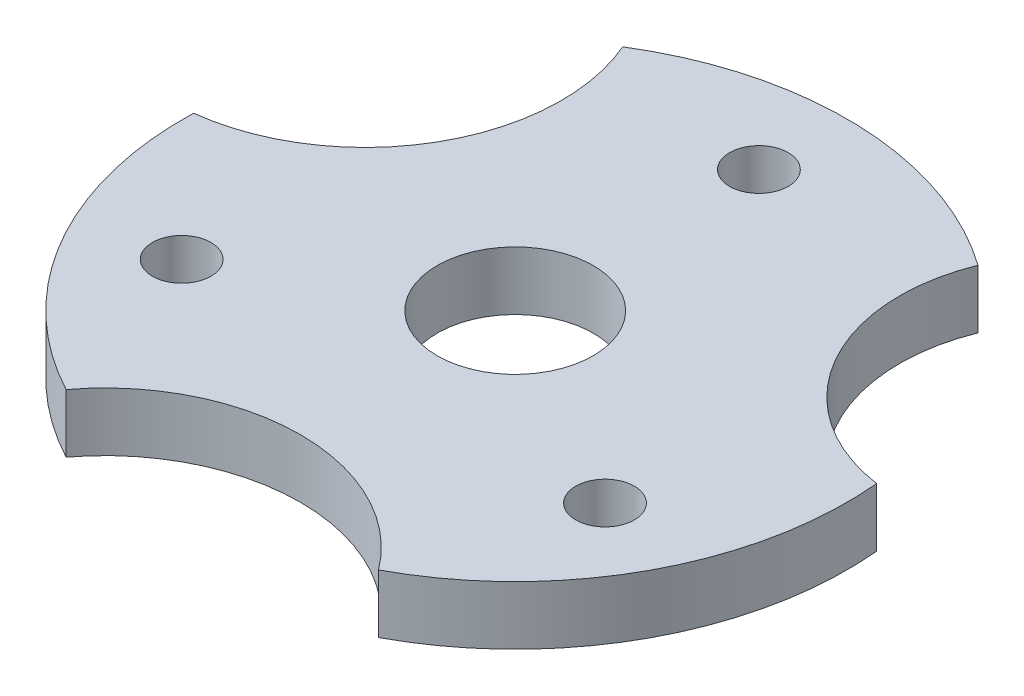
ISO-10303-21;
HEADER;
FILE_DESCRIPTION(('STEP AP214'),'2;1');
FILE_NAME('part.step','',(''),(''),'','','');
FILE_SCHEMA(('AUTOMOTIVE_DESIGN { 1 0 10303 214 1 1 1 1 }'));
ENDSEC;
DATA;
#1=APPLICATION_CONTEXT('core data for automotive mechanical design processes');
#2=APPLICATION_PROTOCOL_DEFINITION('international standard','automotive_design',2000,#1);
#3=PRODUCT_CONTEXT('',#1,'mechanical');
#4=PRODUCT('Part','Part','',(#3));
#5=PRODUCT_RELATED_PRODUCT_CATEGORY('part','',(#4));
#6=PRODUCT_DEFINITION_FORMATION('','',#4);
#7=PRODUCT_DEFINITION_CONTEXT('part definition',#1,'design');
#8=PRODUCT_DEFINITION('design','',#6,#7);
#9=PRODUCT_DEFINITION_SHAPE('','',#8);
#10=(LENGTH_UNIT() NAMED_UNIT(*) SI_UNIT(.MILLI.,.METRE.));
#11=(NAMED_UNIT(*) PLANE_ANGLE_UNIT() SI_UNIT($,.RADIAN.));
#12=(NAMED_UNIT(*) SI_UNIT($,.STERADIAN.) SOLID_ANGLE_UNIT());
#13=UNCERTAINTY_MEASURE_WITH_UNIT(LENGTH_MEASURE(1.E-05),#10,'distance_accuracy_value','');
#14=(GEOMETRIC_REPRESENTATION_CONTEXT(3) GLOBAL_UNCERTAINTY_ASSIGNED_CONTEXT((#13)) GLOBAL_UNIT_ASSIGNED_CONTEXT((#10,
#11,#12)) REPRESENTATION_CONTEXT('',''));
#15=CARTESIAN_POINT('',(0.,0.,0.));
#16=DIRECTION('',(0.,0.,1.));
#17=DIRECTION('',(1.,0.,0.));
#18=AXIS2_PLACEMENT_3D('',#15,#16,#17);
#19=CARTESIAN_POINT('',(0.,-86.,0.));
#20=DIRECTION('',(0.,1.,0.));
#21=DIRECTION('',(0.,0.,-1.));
#22=AXIS2_PLACEMENT_3D('',#19,#20,#21);
#23=CYLINDRICAL_SURFACE('',#22,17.);
#24=DIRECTION('',(0.,1.,0.));
#25=VECTOR('',#24,1.);
#26=CARTESIAN_POINT('',(9.83871252169302,-80.,-13.8636119361255));
#27=LINE('',#26,#25);
#28=CARTESIAN_POINT('',(9.83871252169302,-86.,-13.8636119361255));
#29=VERTEX_POINT('',#28);
#30=CARTESIAN_POINT('',(9.83871252169302,-83.,-13.8636119361255));
#31=VERTEX_POINT('',#30);
#32=EDGE_CURVE('E11',#29,#31,#27,.T.);
#33=ORIENTED_EDGE('',*,*,#32,.F.);
#34=CARTESIAN_POINT('',(0.,-86.,0.));
#35=DIRECTION('',(0.,-1.,0.));
#36=DIRECTION('',(0.,0.,1.));
#37=AXIS2_PLACEMENT_3D('',#34,#35,#36);
#38=CIRCLE('',#37,17.);
#39=CARTESIAN_POINT('',(-8.94741257322652,-86.,-14.454888731653));
#40=VERTEX_POINT('',#39);
#41=EDGE_CURVE('E101',#40,#29,#38,.T.);
#42=ORIENTED_EDGE('',*,*,#41,.F.);
#43=DIRECTION('',(0.,1.,0.));
#44=VECTOR('',#43,1.);
#45=CARTESIAN_POINT('',(-8.94741257322652,-86.,-14.454888731653));
#46=LINE('',#45,#44);
#47=CARTESIAN_POINT('',(-8.94741257322652,-83.,-14.454888731653));
#48=VERTEX_POINT('',#47);
#49=EDGE_CURVE('E126',#40,#48,#46,.T.);
#50=ORIENTED_EDGE('',*,*,#49,.T.);
#51=CARTESIAN_POINT('',(0.,-83.,0.));
#52=DIRECTION('',(0.,-1.,0.));
#53=DIRECTION('',(0.,0.,1.));
#54=AXIS2_PLACEMENT_3D('',#51,#52,#53);
#55=CIRCLE('',#54,17.);
#56=EDGE_CURVE('E121',#48,#31,#55,.T.);
#57=ORIENTED_EDGE('',*,*,#56,.T.);
#58=EDGE_LOOP('',(#33,#42,#50,#57));
#59=FACE_BOUND('',#58,.T.);
#60=ADVANCED_FACE('F34',(#59),#23,.T.);
#61=DIRECTION('',(0.,1.,0.));
#62=VECTOR('',#61,1.);
#63=CARTESIAN_POINT('',(16.9255963857403,-80.,-1.58876901625547));
#64=LINE('',#63,#62);
#65=CARTESIAN_POINT('',(16.9255963857403,-83.,-1.58876901625547));
#66=VERTEX_POINT('',#65);
#67=CARTESIAN_POINT('',(16.9255963857403,-86.,-1.58876901625547));
#68=VERTEX_POINT('',#67);
#69=EDGE_CURVE('E42',#66,#68,#64,.F.);
#70=ORIENTED_EDGE('',*,*,#69,.F.);
#71=CARTESIAN_POINT('',(8.00000000000001,-83.,15.));
#72=VERTEX_POINT('',#71);
#73=EDGE_CURVE('E78',#66,#72,#55,.T.);
#74=ORIENTED_EDGE('',*,*,#73,.T.);
#75=DIRECTION('',(0.,1.,0.));
#76=VECTOR('',#75,1.);
#77=CARTESIAN_POINT('',(8.00000000000001,-86.,15.));
#78=LINE('',#77,#76);
#79=CARTESIAN_POINT('',(8.00000000000001,-86.,15.));
#80=VERTEX_POINT('',#79);
#81=EDGE_CURVE('E104',#80,#72,#78,.T.);
#82=ORIENTED_EDGE('',*,*,#81,.F.);
#83=EDGE_CURVE('E57',#68,#80,#38,.T.);
#84=ORIENTED_EDGE('',*,*,#83,.F.);
#85=EDGE_LOOP('',(#70,#74,#82,#84));
#86=FACE_BOUND('',#85,.T.);
#87=ADVANCED_FACE('F103',(#86),#23,.T.);
#88=CARTESIAN_POINT('',(0.,-86.,10.5));
#89=DIRECTION('',(0.,-1.,0.));
#90=DIRECTION('',(0.,0.,1.));
#91=AXIS2_PLACEMENT_3D('',#88,#89,#90);
#92=PLANE('',#91);
#93=CARTESIAN_POINT('',(-10.8160076466377,-86.,6.26609755652382));
#94=DIRECTION('',(0.,-1.,0.));
#95=DIRECTION('',(0.,0.,1.));
#96=AXIS2_PLACEMENT_3D('',#93,#94,#95);
#97=CIRCLE('',#96,1.5);
#98=CARTESIAN_POINT('',(-10.8160076466377,-86.,7.76609755652382));
#99=VERTEX_POINT('',#98);
#100=EDGE_CURVE('E155',#99,#99,#97,.T.);
#101=ORIENTED_EDGE('',*,*,#100,.F.);
#102=EDGE_LOOP('',(#101));
#103=FACE_BOUND('',#102,.T.);
#104=CARTESIAN_POINT('',(0.,-86.,0.));
#105=DIRECTION('',(0.,-1.,0.));
#106=DIRECTION('',(0.,0.,1.));
#107=AXIS2_PLACEMENT_3D('',#104,#105,#106);
#108=CIRCLE('',#107,4.);
#109=CARTESIAN_POINT('',(0.,-86.,4.));
#110=VERTEX_POINT('',#109);
#111=EDGE_CURVE('E117',#110,#110,#108,.T.);
#112=ORIENTED_EDGE('',*,*,#111,.F.);
#113=EDGE_LOOP('',(#112));
#114=FACE_BOUND('',#113,.T.);
#115=ORIENTED_EDGE('',*,*,#41,.T.);
#116=CARTESIAN_POINT('',(18.1865334794732,-86.,-10.5));
#117=DIRECTION('',(0.,-1.,0.));
#118=DIRECTION('',(0.,0.,1.));
#119=AXIS2_PLACEMENT_3D('',#116,#117,#118);
#120=CIRCLE('',#119,9.);
#121=EDGE_CURVE('E94',#68,#29,#120,.T.);
#122=ORIENTED_EDGE('',*,*,#121,.F.);
#123=ORIENTED_EDGE('',*,*,#83,.T.);
#124=CARTESIAN_POINT('',(0.,-86.,21.));
#125=DIRECTION('',(0.,1.,0.));
#126=DIRECTION('',(0.,0.,1.));
#127=AXIS2_PLACEMENT_3D('',#124,#125,#126);
#128=CIRCLE('',#127,10.);
#129=CARTESIAN_POINT('',(-8.,-86.,15.));
#130=VERTEX_POINT('',#129);
#131=EDGE_CURVE('E124',#80,#130,#128,.T.);
#132=ORIENTED_EDGE('',*,*,#131,.T.);
#133=CARTESIAN_POINT('',(0.,-86.,0.));
#134=DIRECTION('',(0.,-1.,0.));
#135=DIRECTION('',(0.,0.,1.));
#136=AXIS2_PLACEMENT_3D('',#133,#134,#135);
#137=CIRCLE('',#136,17.);
#138=CARTESIAN_POINT('',(-16.9920071371021,-86.,-0.521242220727994));
#139=VERTEX_POINT('',#138);
#140=EDGE_CURVE('E86',#130,#139,#137,.T.);
#141=ORIENTED_EDGE('',*,*,#140,.T.);
#142=CARTESIAN_POINT('',(-18.1865334794732,-86.,-10.5));
#143=DIRECTION('',(0.,1.,0.));
#144=DIRECTION('',(0.,0.,1.));
#145=AXIS2_PLACEMENT_3D('',#142,#143,#144);
#146=CIRCLE('',#145,10.05);
#147=EDGE_CURVE('E106',#139,#40,#146,.T.);
#148=ORIENTED_EDGE('',*,*,#147,.T.);
#149=EDGE_LOOP('',(#115,#122,#123,#132,#141,#148));
#150=FACE_BOUND('',#149,.T.);
#151=CARTESIAN_POINT('',(10.8346034898601,-86.,6.23388861125312));
#152=DIRECTION('',(0.,-1.,0.));
#153=DIRECTION('',(0.,0.,1.));
#154=AXIS2_PLACEMENT_3D('',#151,#152,#153);
#155=CIRCLE('',#154,1.5);
#156=CARTESIAN_POINT('',(10.8346034898601,-86.,7.73388861125312));
#157=VERTEX_POINT('',#156);
#158=EDGE_CURVE('E162',#157,#157,#155,.T.);
#159=ORIENTED_EDGE('',*,*,#158,.F.);
#160=EDGE_LOOP('',(#159));
#161=FACE_BOUND('',#160,.T.);
#162=CARTESIAN_POINT('',(-0.018595843222347,-86.,-12.4999861677769));
#163=DIRECTION('',(0.,-1.,0.));
#164=DIRECTION('',(0.,0.,1.));
#165=AXIS2_PLACEMENT_3D('',#162,#163,#164);
#166=CIRCLE('',#165,1.5);
#167=CARTESIAN_POINT('',(-0.0185958432223473,-86.,-10.9999861677769));
#168=VERTEX_POINT('',#167);
#169=EDGE_CURVE('E149',#168,#168,#166,.T.);
#170=ORIENTED_EDGE('',*,*,#169,.F.);
#171=EDGE_LOOP('',(#170));
#172=FACE_BOUND('',#171,.T.);
#173=ADVANCED_FACE('F98',(#103,#114,#150,#161,#172),#92,.T.);
#174=CARTESIAN_POINT('',(0.,-83.,10.5));
#175=DIRECTION('',(0.,-1.,0.));
#176=DIRECTION('',(0.,0.,1.));
#177=AXIS2_PLACEMENT_3D('',#174,#175,#176);
#178=PLANE('',#177);
#179=CARTESIAN_POINT('',(18.1865334794732,-83.,-10.5));
#180=DIRECTION('',(0.,-1.,0.));
#181=DIRECTION('',(0.,0.,1.));
#182=AXIS2_PLACEMENT_3D('',#179,#180,#181);
#183=CIRCLE('',#182,9.);
#184=EDGE_CURVE('E48',#31,#66,#183,.F.);
#185=ORIENTED_EDGE('',*,*,#184,.F.);
#186=ORIENTED_EDGE('',*,*,#56,.F.);
#187=CARTESIAN_POINT('',(-18.1865334794732,-83.,-10.5));
#188=DIRECTION('',(0.,1.,0.));
#189=DIRECTION('',(0.,0.,1.));
#190=AXIS2_PLACEMENT_3D('',#187,#188,#189);
#191=CIRCLE('',#190,10.05);
#192=CARTESIAN_POINT('',(-16.9920071371021,-83.,-0.521242220727994));
#193=VERTEX_POINT('',#192);
#194=EDGE_CURVE('E119',#193,#48,#191,.T.);
#195=ORIENTED_EDGE('',*,*,#194,.F.);
#196=CARTESIAN_POINT('',(0.,-83.,0.));
#197=DIRECTION('',(0.,-1.,0.));
#198=DIRECTION('',(0.,0.,1.));
#199=AXIS2_PLACEMENT_3D('',#196,#197,#198);
#200=CIRCLE('',#199,17.);
#201=CARTESIAN_POINT('',(-8.,-83.,15.));
#202=VERTEX_POINT('',#201);
#203=EDGE_CURVE('E116',#202,#193,#200,.T.);
#204=ORIENTED_EDGE('',*,*,#203,.F.);
#205=CARTESIAN_POINT('',(0.,-83.,21.));
#206=DIRECTION('',(0.,1.,0.));
#207=DIRECTION('',(0.,0.,1.));
#208=AXIS2_PLACEMENT_3D('',#205,#206,#207);
#209=CIRCLE('',#208,10.);
#210=EDGE_CURVE('E112',#72,#202,#209,.T.);
#211=ORIENTED_EDGE('',*,*,#210,.F.);
#212=ORIENTED_EDGE('',*,*,#73,.F.);
#213=EDGE_LOOP('',(#185,#186,#195,#204,#211,#212));
#214=FACE_BOUND('',#213,.T.);
#215=CARTESIAN_POINT('',(0.,-83.,0.));
#216=DIRECTION('',(0.,-1.,0.));
#217=DIRECTION('',(0.,0.,1.));
#218=AXIS2_PLACEMENT_3D('',#215,#216,#217);
#219=CIRCLE('',#218,4.);
#220=CARTESIAN_POINT('',(0.,-83.,4.));
#221=VERTEX_POINT('',#220);
#222=EDGE_CURVE('E166',#221,#221,#219,.T.);
#223=ORIENTED_EDGE('',*,*,#222,.T.);
#224=EDGE_LOOP('',(#223));
#225=FACE_BOUND('',#224,.T.);
#226=CARTESIAN_POINT('',(10.8346034898601,-83.,6.23388861125312));
#227=DIRECTION('',(0.,-1.,0.));
#228=DIRECTION('',(0.,0.,1.));
#229=AXIS2_PLACEMENT_3D('',#226,#227,#228);
#230=CIRCLE('',#229,1.5);
#231=CARTESIAN_POINT('',(10.8346034898601,-83.,7.73388861125312));
#232=VERTEX_POINT('',#231);
#233=EDGE_CURVE('E158',#232,#232,#230,.T.);
#234=ORIENTED_EDGE('',*,*,#233,.T.);
#235=EDGE_LOOP('',(#234));
#236=FACE_BOUND('',#235,.T.);
#237=CARTESIAN_POINT('',(-10.8160076466377,-83.,6.26609755652382));
#238=DIRECTION('',(0.,-1.,0.));
#239=DIRECTION('',(0.,0.,1.));
#240=AXIS2_PLACEMENT_3D('',#237,#238,#239);
#241=CIRCLE('',#240,1.5);
#242=CARTESIAN_POINT('',(-10.8160076466377,-83.,7.76609755652382));
#243=VERTEX_POINT('',#242);
#244=EDGE_CURVE('E153',#243,#243,#241,.T.);
#245=ORIENTED_EDGE('',*,*,#244,.T.);
#246=EDGE_LOOP('',(#245));
#247=FACE_BOUND('',#246,.T.);
#248=CARTESIAN_POINT('',(-0.018595843222347,-83.,-12.4999861677769));
#249=DIRECTION('',(0.,-1.,0.));
#250=DIRECTION('',(0.,0.,1.));
#251=AXIS2_PLACEMENT_3D('',#248,#249,#250);
#252=CIRCLE('',#251,1.5);
#253=CARTESIAN_POINT('',(-0.0185958432223473,-83.,-10.9999861677769));
#254=VERTEX_POINT('',#253);
#255=EDGE_CURVE('E146',#254,#254,#252,.T.);
#256=ORIENTED_EDGE('',*,*,#255,.T.);
#257=EDGE_LOOP('',(#256));
#258=FACE_BOUND('',#257,.T.);
#259=ADVANCED_FACE('F137',(#214,#225,#236,#247,#258),#178,.F.);
#260=CARTESIAN_POINT('',(0.,-86.,21.));
#261=DIRECTION('',(0.,1.,0.));
#262=DIRECTION('',(0.,0.,-1.));
#263=AXIS2_PLACEMENT_3D('',#260,#261,#262);
#264=CYLINDRICAL_SURFACE('',#263,10.);
#265=ORIENTED_EDGE('',*,*,#210,.T.);
#266=DIRECTION('',(0.,1.,0.));
#267=VECTOR('',#266,1.);
#268=CARTESIAN_POINT('',(-8.,-86.,15.));
#269=LINE('',#268,#267);
#270=EDGE_CURVE('E96',#130,#202,#269,.T.);
#271=ORIENTED_EDGE('',*,*,#270,.F.);
#272=ORIENTED_EDGE('',*,*,#131,.F.);
#273=ORIENTED_EDGE('',*,*,#81,.T.);
#274=EDGE_LOOP('',(#265,#271,#272,#273));
#275=FACE_BOUND('',#274,.T.);
#276=ADVANCED_FACE('F36',(#275),#264,.F.);
#277=CARTESIAN_POINT('',(0.,-86.,0.));
#278=DIRECTION('',(0.,1.,0.));
#279=DIRECTION('',(0.,0.,-1.));
#280=AXIS2_PLACEMENT_3D('',#277,#278,#279);
#281=CYLINDRICAL_SURFACE('',#280,17.);
#282=ORIENTED_EDGE('',*,*,#203,.T.);
#283=DIRECTION('',(0.,1.,0.));
#284=VECTOR('',#283,1.);
#285=CARTESIAN_POINT('',(-16.9920071371021,-86.,-0.521242220727994));
#286=LINE('',#285,#284);
#287=EDGE_CURVE('E129',#139,#193,#286,.T.);
#288=ORIENTED_EDGE('',*,*,#287,.F.);
#289=ORIENTED_EDGE('',*,*,#140,.F.);
#290=ORIENTED_EDGE('',*,*,#270,.T.);
#291=EDGE_LOOP('',(#282,#288,#289,#290));
#292=FACE_BOUND('',#291,.T.);
#293=ADVANCED_FACE('F133',(#292),#281,.T.);
#294=CARTESIAN_POINT('',(-18.1865334794732,-86.,-10.5));
#295=DIRECTION('',(0.,1.,0.));
#296=DIRECTION('',(0.,0.,-1.));
#297=AXIS2_PLACEMENT_3D('',#294,#295,#296);
#298=CYLINDRICAL_SURFACE('',#297,10.05);
#299=ORIENTED_EDGE('',*,*,#194,.T.);
#300=ORIENTED_EDGE('',*,*,#49,.F.);
#301=ORIENTED_EDGE('',*,*,#147,.F.);
#302=ORIENTED_EDGE('',*,*,#287,.T.);
#303=EDGE_LOOP('',(#299,#300,#301,#302));
#304=FACE_BOUND('',#303,.T.);
#305=ADVANCED_FACE('F143',(#304),#298,.F.);
#306=CARTESIAN_POINT('',(0.,-86.,0.));
#307=DIRECTION('',(0.,1.,0.));
#308=DIRECTION('',(0.,0.,-1.));
#309=AXIS2_PLACEMENT_3D('',#306,#307,#308);
#310=CYLINDRICAL_SURFACE('',#309,4.);
#311=ORIENTED_EDGE('',*,*,#111,.T.);
#312=EDGE_LOOP('',(#311));
#313=FACE_BOUND('',#312,.T.);
#314=ORIENTED_EDGE('',*,*,#222,.F.);
#315=EDGE_LOOP('',(#314));
#316=FACE_BOUND('',#315,.T.);
#317=ADVANCED_FACE('F186',(#313,#316),#310,.F.);
#318=CARTESIAN_POINT('',(10.8346034898601,-86.,6.23388861125312));
#319=DIRECTION('',(0.,1.,0.));
#320=DIRECTION('',(0.,0.,-1.));
#321=AXIS2_PLACEMENT_3D('',#318,#319,#320);
#322=CYLINDRICAL_SURFACE('',#321,1.5);
#323=ORIENTED_EDGE('',*,*,#158,.T.);
#324=EDGE_LOOP('',(#323));
#325=FACE_BOUND('',#324,.T.);
#326=ORIENTED_EDGE('',*,*,#233,.F.);
#327=EDGE_LOOP('',(#326));
#328=FACE_BOUND('',#327,.T.);
#329=ADVANCED_FACE('F190',(#325,#328),#322,.F.);
#330=CARTESIAN_POINT('',(-10.8160076466377,-86.,6.26609755652382));
#331=DIRECTION('',(0.,1.,0.));
#332=DIRECTION('',(0.,0.,-1.));
#333=AXIS2_PLACEMENT_3D('',#330,#331,#332);
#334=CYLINDRICAL_SURFACE('',#333,1.5);
#335=ORIENTED_EDGE('',*,*,#100,.T.);
#336=EDGE_LOOP('',(#335));
#337=FACE_BOUND('',#336,.T.);
#338=ORIENTED_EDGE('',*,*,#244,.F.);
#339=EDGE_LOOP('',(#338));
#340=FACE_BOUND('',#339,.T.);
#341=ADVANCED_FACE('F206',(#337,#340),#334,.F.);
#342=CARTESIAN_POINT('',(-0.018595843222347,-86.,-12.4999861677769));
#343=DIRECTION('',(0.,1.,0.));
#344=DIRECTION('',(0.,0.,-1.));
#345=AXIS2_PLACEMENT_3D('',#342,#343,#344);
#346=CYLINDRICAL_SURFACE('',#345,1.5);
#347=ORIENTED_EDGE('',*,*,#169,.T.);
#348=EDGE_LOOP('',(#347));
#349=FACE_BOUND('',#348,.T.);
#350=ORIENTED_EDGE('',*,*,#255,.F.);
#351=EDGE_LOOP('',(#350));
#352=FACE_BOUND('',#351,.T.);
#353=ADVANCED_FACE('F217',(#349,#352),#346,.F.);
#354=CARTESIAN_POINT('',(18.1865334794732,-86.,-10.5));
#355=DIRECTION('',(0.,1.,0.));
#356=DIRECTION('',(0.,0.,-1.));
#357=AXIS2_PLACEMENT_3D('',#354,#355,#356);
#358=CYLINDRICAL_SURFACE('',#357,9.);
#359=ORIENTED_EDGE('',*,*,#32,.T.);
#360=ORIENTED_EDGE('',*,*,#184,.T.);
#361=ORIENTED_EDGE('',*,*,#69,.T.);
#362=ORIENTED_EDGE('',*,*,#121,.T.);
#363=EDGE_LOOP('',(#359,#360,#361,#362));
#364=FACE_BOUND('',#363,.T.);
#365=ADVANCED_FACE('F93',(#364),#358,.F.);
#366=CLOSED_SHELL('',(#60,#87,#173,#259,#276,#293,#305,#317,#329,#341,#353,#365));
#367=MANIFOLD_SOLID_BREP('B2',#366);
#368=ADVANCED_BREP_SHAPE_REPRESENTATION('',(#18,#367),#14);
#369=SHAPE_DEFINITION_REPRESENTATION(#9,#368);
ENDSEC;
END-ISO-10303-21;
